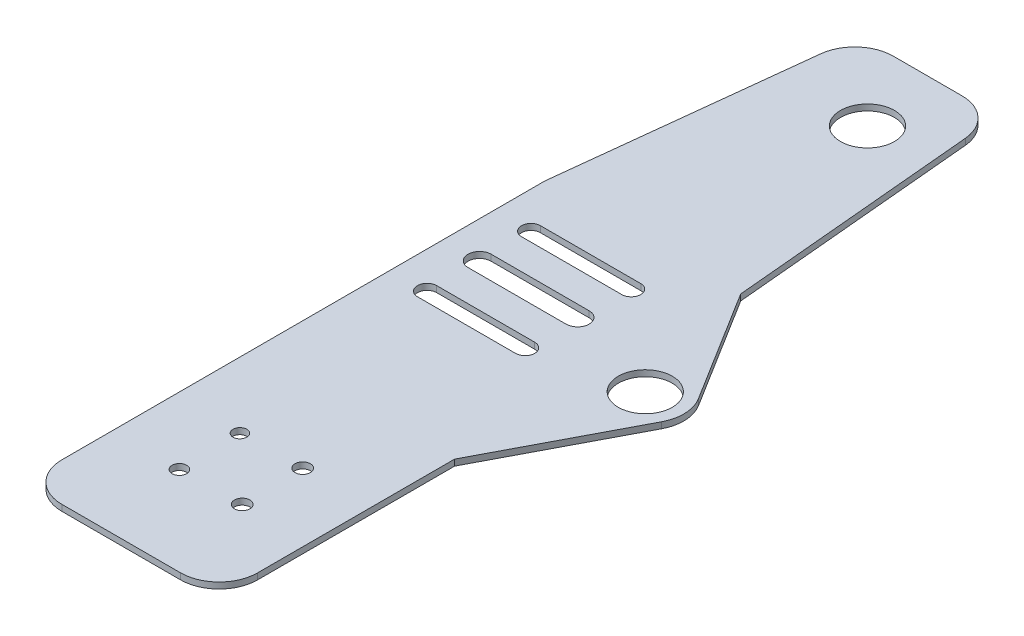
ISO-10303-21;
HEADER;
FILE_DESCRIPTION(('STEP AP214'),'2;1');
FILE_NAME('part.step','',(''),(''),'','','');
FILE_SCHEMA(('AUTOMOTIVE_DESIGN { 1 0 10303 214 1 1 1 1 }'));
ENDSEC;
DATA;
#1=APPLICATION_CONTEXT('core data for automotive mechanical design processes');
#2=APPLICATION_PROTOCOL_DEFINITION('international standard','automotive_design',2000,#1);
#3=PRODUCT_CONTEXT('',#1,'mechanical');
#4=PRODUCT('Part','Part','',(#3));
#5=PRODUCT_RELATED_PRODUCT_CATEGORY('part','',(#4));
#6=PRODUCT_DEFINITION_FORMATION('','',#4);
#7=PRODUCT_DEFINITION_CONTEXT('part definition',#1,'design');
#8=PRODUCT_DEFINITION('design','',#6,#7);
#9=PRODUCT_DEFINITION_SHAPE('','',#8);
#10=(LENGTH_UNIT() NAMED_UNIT(*) SI_UNIT(.MILLI.,.METRE.));
#11=(NAMED_UNIT(*) PLANE_ANGLE_UNIT() SI_UNIT($,.RADIAN.));
#12=(NAMED_UNIT(*) SI_UNIT($,.STERADIAN.) SOLID_ANGLE_UNIT());
#13=UNCERTAINTY_MEASURE_WITH_UNIT(LENGTH_MEASURE(1.E-05),#10,'distance_accuracy_value','');
#14=(GEOMETRIC_REPRESENTATION_CONTEXT(3) GLOBAL_UNCERTAINTY_ASSIGNED_CONTEXT((#13)) GLOBAL_UNIT_ASSIGNED_CONTEXT((#10,
#11,#12)) REPRESENTATION_CONTEXT('',''));
#15=CARTESIAN_POINT('',(0.,0.,0.));
#16=DIRECTION('',(0.,0.,1.));
#17=DIRECTION('',(1.,0.,0.));
#18=AXIS2_PLACEMENT_3D('',#15,#16,#17);
#19=CARTESIAN_POINT('',(50.8,1.5875,0.));
#20=DIRECTION('',(-1.,0.,0.));
#21=DIRECTION('',(0.,0.,1.));
#22=AXIS2_PLACEMENT_3D('',#19,#20,#21);
#23=PLANE('',#22);
#24=DIRECTION('',(0.,1.,0.));
#25=VECTOR('',#24,1.);
#26=CARTESIAN_POINT('',(50.8,0.,-61.1242433169714));
#27=LINE('',#26,#25);
#28=CARTESIAN_POINT('',(50.8,0.,-61.1242433169714));
#29=VERTEX_POINT('',#28);
#30=CARTESIAN_POINT('',(50.8,1.5875,-61.1242433169714));
#31=VERTEX_POINT('',#30);
#32=EDGE_CURVE('E219',#29,#31,#27,.T.);
#33=ORIENTED_EDGE('',*,*,#32,.T.);
#34=DIRECTION('',(0.,0.,-1.));
#35=VECTOR('',#34,1.);
#36=CARTESIAN_POINT('',(50.8,1.5875,0.));
#37=LINE('',#36,#35);
#38=CARTESIAN_POINT('',(50.8,1.5875,-10.));
#39=VERTEX_POINT('',#38);
#40=EDGE_CURVE('E278',#39,#31,#37,.T.);
#41=ORIENTED_EDGE('',*,*,#40,.F.);
#42=DIRECTION('',(0.,-1.,0.));
#43=VECTOR('',#42,1.);
#44=CARTESIAN_POINT('',(50.8,1.5875,-10.));
#45=LINE('',#44,#43);
#46=CARTESIAN_POINT('',(50.8,0.,-10.));
#47=VERTEX_POINT('',#46);
#48=EDGE_CURVE('E231',#39,#47,#45,.T.);
#49=ORIENTED_EDGE('',*,*,#48,.T.);
#50=DIRECTION('',(0.,0.,-1.));
#51=VECTOR('',#50,1.);
#52=CARTESIAN_POINT('',(50.8,0.,0.));
#53=LINE('',#52,#51);
#54=EDGE_CURVE('E211',#47,#29,#53,.T.);
#55=ORIENTED_EDGE('',*,*,#54,.T.);
#56=EDGE_LOOP('',(#33,#41,#49,#55));
#57=FACE_BOUND('',#56,.T.);
#58=ADVANCED_FACE('F36',(#57),#23,.F.);
#59=CARTESIAN_POINT('',(62.5839450667383,1.5875,-5.68716003291169));
#60=DIRECTION('',(0.995896490758646,0.,-0.0904996115716226));
#61=DIRECTION('',(-0.0904996115716226,0.,-0.995896490758646));
#62=AXIS2_PLACEMENT_3D('',#59,#60,#61);
#63=PLANE('',#62);
#64=DIRECTION('',(0.0904996115716226,0.,0.995896490758646));
#65=VECTOR('',#64,1.);
#66=CARTESIAN_POINT('',(62.5839450667383,0.,-5.68716003291169));
#67=LINE('',#66,#65);
#68=CARTESIAN_POINT('',(44.9712322558071,0.,-199.504996115716));
#69=VERTEX_POINT('',#68);
#70=CARTESIAN_POINT('',(50.8,0.,-135.362739137133));
#71=VERTEX_POINT('',#70);
#72=EDGE_CURVE('E245',#69,#71,#67,.T.);
#73=ORIENTED_EDGE('',*,*,#72,.F.);
#74=DIRECTION('',(0.,1.,0.));
#75=VECTOR('',#74,1.);
#76=CARTESIAN_POINT('',(44.9712322558071,1.5875,-199.504996115716));
#77=LINE('',#76,#75);
#78=CARTESIAN_POINT('',(44.9712322558071,1.5875,-199.504996115716));
#79=VERTEX_POINT('',#78);
#80=EDGE_CURVE('E285',#69,#79,#77,.T.);
#81=ORIENTED_EDGE('',*,*,#80,.T.);
#82=DIRECTION('',(0.0904996115716226,0.,0.995896490758646));
#83=VECTOR('',#82,1.);
#84=CARTESIAN_POINT('',(62.5839450667383,1.5875,-5.68716003291169));
#85=LINE('',#84,#83);
#86=CARTESIAN_POINT('',(50.8,1.5875,-135.362739137133));
#87=VERTEX_POINT('',#86);
#88=EDGE_CURVE('E378',#79,#87,#85,.T.);
#89=ORIENTED_EDGE('',*,*,#88,.T.);
#90=DIRECTION('',(0.,-1.,0.));
#91=VECTOR('',#90,1.);
#92=CARTESIAN_POINT('',(50.8,1.5875,-135.362739137133));
#93=LINE('',#92,#91);
#94=EDGE_CURVE('E254',#87,#71,#93,.T.);
#95=ORIENTED_EDGE('',*,*,#94,.T.);
#96=EDGE_LOOP('',(#73,#81,#89,#95));
#97=FACE_BOUND('',#96,.T.);
#98=ADVANCED_FACE('F454',(#97),#63,.T.);
#99=CARTESIAN_POINT('',(-14.98921776084,1.5875,-1.68067913585209));
#100=DIRECTION('',(0.99377255268871,0.,0.111427615619135));
#101=DIRECTION('',(0.111427615619135,0.,-0.99377255268871));
#102=AXIS2_PLACEMENT_3D('',#99,#100,#101);
#103=PLANE('',#102);
#104=DIRECTION('',(-0.111427615619135,0.,0.99377255268871));
#105=VECTOR('',#104,1.);
#106=CARTESIAN_POINT('',(-14.98921776084,1.5875,-1.68067913585209));
#107=LINE('',#106,#105);
#108=CARTESIAN_POINT('',(7.21547230506596,1.5875,-199.714276156191));
#109=VERTEX_POINT('',#108);
#110=CARTESIAN_POINT('',(0.,1.5875,-135.362739137134));
#111=VERTEX_POINT('',#110);
#112=EDGE_CURVE('E383',#109,#111,#107,.T.);
#113=ORIENTED_EDGE('',*,*,#112,.F.);
#114=DIRECTION('',(0.,1.,0.));
#115=VECTOR('',#114,1.);
#116=CARTESIAN_POINT('',(7.21547230506596,0.,-199.714276156191));
#117=LINE('',#116,#115);
#118=CARTESIAN_POINT('',(7.21547230506596,0.,-199.714276156191));
#119=VERTEX_POINT('',#118);
#120=EDGE_CURVE('E11',#109,#119,#117,.F.);
#121=ORIENTED_EDGE('',*,*,#120,.T.);
#122=DIRECTION('',(-0.111427615619135,0.,0.99377255268871));
#123=VECTOR('',#122,1.);
#124=CARTESIAN_POINT('',(-14.98921776084,0.,-1.68067913585209));
#125=LINE('',#124,#123);
#126=CARTESIAN_POINT('',(0.,0.,-135.362739137134));
#127=VERTEX_POINT('',#126);
#128=EDGE_CURVE('E247',#119,#127,#125,.T.);
#129=ORIENTED_EDGE('',*,*,#128,.T.);
#130=DIRECTION('',(0.,-1.,0.));
#131=VECTOR('',#130,1.);
#132=CARTESIAN_POINT('',(0.,1.5875,-135.362739137134));
#133=LINE('',#132,#131);
#134=EDGE_CURVE('E251',#111,#127,#133,.T.);
#135=ORIENTED_EDGE('',*,*,#134,.F.);
#136=EDGE_LOOP('',(#113,#121,#129,#135));
#137=FACE_BOUND('',#136,.T.);
#138=ADVANCED_FACE('F459',(#137),#103,.F.);
#139=CARTESIAN_POINT('',(0.,1.5875,0.));
#140=DIRECTION('',(0.,1.,0.));
#141=DIRECTION('',(0.,0.,1.));
#142=AXIS2_PLACEMENT_3D('',#139,#140,#141);
#143=PLANE('',#142);
#144=CARTESIAN_POINT('',(60.4000000000002,1.5875,-101.000996728214));
#145=DIRECTION('',(0.,1.,0.));
#146=DIRECTION('',(0.,0.,1.));
#147=AXIS2_PLACEMENT_3D('',#144,#145,#146);
#148=CIRCLE('',#147,7.);
#149=CARTESIAN_POINT('',(60.4000000000002,1.5875,-94.0009967282143));
#150=VERTEX_POINT('',#149);
#151=EDGE_CURVE('E505',#150,#150,#148,.T.);
#152=ORIENTED_EDGE('',*,*,#151,.F.);
#153=EDGE_LOOP('',(#152));
#154=FACE_BOUND('',#153,.T.);
#155=DIRECTION('',(-0.52824164194853,0.,-0.849094086489548));
#156=VECTOR('',#155,1.);
#157=CARTESIAN_POINT('',(97.3386305900608,1.5875,-60.5566790136255));
#158=LINE('',#157,#156);
#159=CARTESIAN_POINT('',(68.8909408648957,1.5875,-106.2834131477));
#160=VERTEX_POINT('',#159);
#161=EDGE_CURVE('E216',#160,#87,#158,.T.);
#162=ORIENTED_EDGE('',*,*,#161,.T.);
#163=ORIENTED_EDGE('',*,*,#88,.F.);
#164=CARTESIAN_POINT('',(35.0122673482206,1.5875,-198.6));
#165=DIRECTION('',(0.,1.,0.));
#166=DIRECTION('',(0.,0.,1.));
#167=AXIS2_PLACEMENT_3D('',#164,#165,#166);
#168=CIRCLE('',#167,10.);
#169=CARTESIAN_POINT('',(35.0122673482206,1.5875,-208.6));
#170=VERTEX_POINT('',#169);
#171=EDGE_CURVE('E288',#79,#170,#168,.T.);
#172=ORIENTED_EDGE('',*,*,#171,.T.);
#173=DIRECTION('',(-1.,0.,0.));
#174=VECTOR('',#173,1.);
#175=CARTESIAN_POINT('',(0.,1.5875,-208.6));
#176=LINE('',#175,#174);
#177=CARTESIAN_POINT('',(17.1531978319531,1.5875,-208.6));
#178=VERTEX_POINT('',#177);
#179=EDGE_CURVE('E316',#170,#178,#176,.T.);
#180=ORIENTED_EDGE('',*,*,#179,.T.);
#181=CARTESIAN_POINT('',(17.1531978319531,1.5875,-198.6));
#182=DIRECTION('',(0.,1.,0.));
#183=DIRECTION('',(0.,0.,1.));
#184=AXIS2_PLACEMENT_3D('',#181,#182,#183);
#185=CIRCLE('',#184,10.);
#186=EDGE_CURVE('E59',#178,#109,#185,.T.);
#187=ORIENTED_EDGE('',*,*,#186,.T.);
#188=ORIENTED_EDGE('',*,*,#112,.T.);
#189=DIRECTION('',(0.,0.,-1.));
#190=VECTOR('',#189,1.);
#191=CARTESIAN_POINT('',(0.,1.5875,0.));
#192=LINE('',#191,#190);
#193=CARTESIAN_POINT('',(0.,1.5875,-10.));
#194=VERTEX_POINT('',#193);
#195=EDGE_CURVE('E385',#194,#111,#192,.T.);
#196=ORIENTED_EDGE('',*,*,#195,.F.);
#197=CARTESIAN_POINT('',(10.,1.5875,-10.));
#198=DIRECTION('',(0.,1.,0.));
#199=DIRECTION('',(0.,0.,1.));
#200=AXIS2_PLACEMENT_3D('',#197,#198,#199);
#201=CIRCLE('',#200,10.);
#202=CARTESIAN_POINT('',(10.,1.5875,0.));
#203=VERTEX_POINT('',#202);
#204=EDGE_CURVE('E307',#194,#203,#201,.T.);
#205=ORIENTED_EDGE('',*,*,#204,.T.);
#206=DIRECTION('',(1.,0.,0.));
#207=VECTOR('',#206,1.);
#208=CARTESIAN_POINT('',(0.,1.5875,0.));
#209=LINE('',#208,#207);
#210=CARTESIAN_POINT('',(40.8,1.5875,0.));
#211=VERTEX_POINT('',#210);
#212=EDGE_CURVE('E380',#203,#211,#209,.T.);
#213=ORIENTED_EDGE('',*,*,#212,.T.);
#214=CARTESIAN_POINT('',(40.8,1.5875,-10.));
#215=DIRECTION('',(0.,1.,0.));
#216=DIRECTION('',(0.,0.,1.));
#217=AXIS2_PLACEMENT_3D('',#214,#215,#216);
#218=CIRCLE('',#217,10.);
#219=EDGE_CURVE('E309',#211,#39,#218,.T.);
#220=ORIENTED_EDGE('',*,*,#219,.T.);
#221=ORIENTED_EDGE('',*,*,#40,.T.);
#222=DIRECTION('',(-0.464026819232771,0.,0.885821150702961));
#223=VECTOR('',#222,1.);
#224=CARTESIAN_POINT('',(14.7368982455347,1.5875,7.71974795680346));
#225=LINE('',#224,#223);
#226=CARTESIAN_POINT('',(69.2582115070298,1.5875,-96.3607285358866));
#227=VERTEX_POINT('',#226);
#228=EDGE_CURVE('E222',#227,#31,#225,.T.);
#229=ORIENTED_EDGE('',*,*,#228,.F.);
#230=CARTESIAN_POINT('',(60.4000000000002,1.5875,-101.000996728214));
#231=DIRECTION('',(0.,1.,0.));
#232=DIRECTION('',(0.,0.,1.));
#233=AXIS2_PLACEMENT_3D('',#230,#231,#232);
#234=CIRCLE('',#233,9.99999999999999);
#235=EDGE_CURVE('E494',#227,#160,#234,.T.);
#236=ORIENTED_EDGE('',*,*,#235,.T.);
#237=EDGE_LOOP('',(#162,#163,#172,#180,#187,#188,#196,#205,#213,#220,#221,#229,#236));
#238=FACE_BOUND('',#237,.T.);
#239=CARTESIAN_POINT('',(35.5096753408515,1.5875,-122.250359096769));
#240=DIRECTION('',(0.,1.,0.));
#241=DIRECTION('',(0.,0.,1.));
#242=AXIS2_PLACEMENT_3D('',#239,#240,#241);
#243=CIRCLE('',#242,2.46542385323101);
#244=CARTESIAN_POINT('',(35.5096753408515,1.5875,-119.784935243538));
#245=VERTEX_POINT('',#244);
#246=CARTESIAN_POINT('',(35.5096753408515,1.5875,-124.71578295));
#247=VERTEX_POINT('',#246);
#248=EDGE_CURVE('E232',#245,#247,#243,.T.);
#249=ORIENTED_EDGE('',*,*,#248,.F.);
#250=DIRECTION('',(1.,0.,0.));
#251=VECTOR('',#250,1.);
#252=CARTESIAN_POINT('',(0.,1.5875,-119.784935243538));
#253=LINE('',#252,#251);
#254=CARTESIAN_POINT('',(9.49203327256304,1.5875,-119.784935243538));
#255=VERTEX_POINT('',#254);
#256=EDGE_CURVE('E236',#255,#245,#253,.T.);
#257=ORIENTED_EDGE('',*,*,#256,.F.);
#258=CARTESIAN_POINT('',(9.49203327256303,1.5875,-122.250359096769));
#259=DIRECTION('',(0.,1.,0.));
#260=DIRECTION('',(0.,0.,1.));
#261=AXIS2_PLACEMENT_3D('',#258,#259,#260);
#262=CIRCLE('',#261,2.465423853231);
#263=CARTESIAN_POINT('',(9.49203327256303,1.5875,-124.71578295));
#264=VERTEX_POINT('',#263);
#265=EDGE_CURVE('E336',#264,#255,#262,.T.);
#266=ORIENTED_EDGE('',*,*,#265,.F.);
#267=DIRECTION('',(1.,0.,0.));
#268=VECTOR('',#267,1.);
#269=CARTESIAN_POINT('',(0.,1.5875,-124.71578295));
#270=LINE('',#269,#268);
#271=EDGE_CURVE('E339',#264,#247,#270,.T.);
#272=ORIENTED_EDGE('',*,*,#271,.T.);
#273=EDGE_LOOP('',(#249,#257,#266,#272));
#274=FACE_BOUND('',#273,.T.);
#275=CARTESIAN_POINT('',(9.49203327256301,1.5875,-108.90993524));
#276=DIRECTION('',(0.,1.,0.));
#277=DIRECTION('',(0.,0.,1.));
#278=AXIS2_PLACEMENT_3D('',#275,#276,#277);
#279=CIRCLE('',#278,3.);
#280=CARTESIAN_POINT('',(9.49203327256301,1.5875,-111.90993524));
#281=VERTEX_POINT('',#280);
#282=CARTESIAN_POINT('',(9.49203327256301,1.5875,-105.90993524));
#283=VERTEX_POINT('',#282);
#284=EDGE_CURVE('E341',#281,#283,#279,.T.);
#285=ORIENTED_EDGE('',*,*,#284,.F.);
#286=DIRECTION('',(1.,0.,0.));
#287=VECTOR('',#286,1.);
#288=CARTESIAN_POINT('',(0.,1.5875,-111.90993524));
#289=LINE('',#288,#287);
#290=CARTESIAN_POINT('',(34.9257409027608,1.5875,-111.90993524));
#291=VERTEX_POINT('',#290);
#292=EDGE_CURVE('E344',#281,#291,#289,.T.);
#293=ORIENTED_EDGE('',*,*,#292,.T.);
#294=CARTESIAN_POINT('',(34.9257409027608,1.5875,-108.90993524));
#295=DIRECTION('',(0.,1.,0.));
#296=DIRECTION('',(0.,0.,1.));
#297=AXIS2_PLACEMENT_3D('',#294,#295,#296);
#298=CIRCLE('',#297,3.);
#299=CARTESIAN_POINT('',(34.9257409027608,1.5875,-105.90993524));
#300=VERTEX_POINT('',#299);
#301=EDGE_CURVE('E346',#300,#291,#298,.T.);
#302=ORIENTED_EDGE('',*,*,#301,.F.);
#303=DIRECTION('',(1.,0.,0.));
#304=VECTOR('',#303,1.);
#305=CARTESIAN_POINT('',(0.,1.5875,-105.90993524));
#306=LINE('',#305,#304);
#307=EDGE_CURVE('E349',#283,#300,#306,.T.);
#308=ORIENTED_EDGE('',*,*,#307,.F.);
#309=EDGE_LOOP('',(#285,#293,#302,#308));
#310=FACE_BOUND('',#309,.T.);
#311=CARTESIAN_POINT('',(34.9257409027608,1.5875,-95.28493524));
#312=DIRECTION('',(0.,1.,0.));
#313=DIRECTION('',(0.,0.,1.));
#314=AXIS2_PLACEMENT_3D('',#311,#312,#313);
#315=CIRCLE('',#314,2.5);
#316=CARTESIAN_POINT('',(34.9257409027608,1.5875,-92.78493524));
#317=VERTEX_POINT('',#316);
#318=CARTESIAN_POINT('',(34.9257409027608,1.5875,-97.78493524));
#319=VERTEX_POINT('',#318);
#320=EDGE_CURVE('E352',#317,#319,#315,.T.);
#321=ORIENTED_EDGE('',*,*,#320,.F.);
#322=DIRECTION('',(1.,0.,0.));
#323=VECTOR('',#322,1.);
#324=CARTESIAN_POINT('',(0.,1.5875,-92.78493524));
#325=LINE('',#324,#323);
#326=CARTESIAN_POINT('',(9.49203327256304,1.5875,-92.78493524));
#327=VERTEX_POINT('',#326);
#328=EDGE_CURVE('E355',#327,#317,#325,.T.);
#329=ORIENTED_EDGE('',*,*,#328,.F.);
#330=CARTESIAN_POINT('',(9.49203327256304,1.5875,-95.28493524));
#331=DIRECTION('',(0.,1.,0.));
#332=DIRECTION('',(0.,0.,1.));
#333=AXIS2_PLACEMENT_3D('',#330,#331,#332);
#334=CIRCLE('',#333,2.5);
#335=CARTESIAN_POINT('',(9.49203327256304,1.5875,-97.78493524));
#336=VERTEX_POINT('',#335);
#337=EDGE_CURVE('E358',#336,#327,#334,.T.);
#338=ORIENTED_EDGE('',*,*,#337,.F.);
#339=DIRECTION('',(1.,0.,0.));
#340=VECTOR('',#339,1.);
#341=CARTESIAN_POINT('',(0.,1.5875,-97.78493524));
#342=LINE('',#341,#340);
#343=EDGE_CURVE('E361',#336,#319,#342,.T.);
#344=ORIENTED_EDGE('',*,*,#343,.T.);
#345=EDGE_LOOP('',(#321,#329,#338,#344));
#346=FACE_BOUND('',#345,.T.);
#347=CARTESIAN_POINT('',(17.1273843845573,1.5875,-39.079069546219));
#348=DIRECTION('',(0.,1.,0.));
#349=DIRECTION('',(0.,0.,1.));
#350=AXIS2_PLACEMENT_3D('',#347,#348,#349);
#351=CIRCLE('',#350,1.78603357375501);
#352=CARTESIAN_POINT('',(17.1273843845573,1.5875,-37.293035972464));
#353=VERTEX_POINT('',#352);
#354=EDGE_CURVE('E363',#353,#353,#351,.T.);
#355=ORIENTED_EDGE('',*,*,#354,.F.);
#356=EDGE_LOOP('',(#355));
#357=FACE_BOUND('',#356,.T.);
#358=CARTESIAN_POINT('',(33.1247368376099,1.5875,-39.370127088315));
#359=DIRECTION('',(0.,1.,0.));
#360=DIRECTION('',(0.,0.,1.));
#361=AXIS2_PLACEMENT_3D('',#358,#359,#360);
#362=CIRCLE('',#361,2.00000000001303);
#363=CARTESIAN_POINT('',(33.1247368376099,1.5875,-37.370127088302));
#364=VERTEX_POINT('',#363);
#365=EDGE_CURVE('E366',#364,#364,#362,.T.);
#366=ORIENTED_EDGE('',*,*,#365,.F.);
#367=EDGE_LOOP('',(#366));
#368=FACE_BOUND('',#367,.T.);
#369=CARTESIAN_POINT('',(33.4157943797059,1.5875,-23.3727746352624));
#370=DIRECTION('',(0.,1.,0.));
#371=DIRECTION('',(0.,0.,1.));
#372=AXIS2_PLACEMENT_3D('',#369,#370,#371);
#373=CIRCLE('',#372,2.0000000000001);
#374=CARTESIAN_POINT('',(33.4157943797059,1.5875,-21.3727746352623));
#375=VERTEX_POINT('',#374);
#376=EDGE_CURVE('E369',#375,#375,#373,.T.);
#377=ORIENTED_EDGE('',*,*,#376,.F.);
#378=EDGE_LOOP('',(#377));
#379=FACE_BOUND('',#378,.T.);
#380=CARTESIAN_POINT('',(17.4184419266594,1.5875,-23.0817170930641));
#381=DIRECTION('',(0.,1.,0.));
#382=DIRECTION('',(0.,0.,1.));
#383=AXIS2_PLACEMENT_3D('',#380,#381,#382);
#384=CIRCLE('',#383,1.89697912822348);
#385=CARTESIAN_POINT('',(17.4184419266594,1.5875,-21.1847379648406));
#386=VERTEX_POINT('',#385);
#387=EDGE_CURVE('E372',#386,#386,#384,.T.);
#388=ORIENTED_EDGE('',*,*,#387,.F.);
#389=EDGE_LOOP('',(#388));
#390=FACE_BOUND('',#389,.T.);
#391=CARTESIAN_POINT('',(29.5042134535758,1.5875,-189.557234371763));
#392=DIRECTION('',(0.,1.,0.));
#393=DIRECTION('',(0.,0.,1.));
#394=AXIS2_PLACEMENT_3D('',#391,#392,#393);
#395=CIRCLE('',#394,7.);
#396=CARTESIAN_POINT('',(29.5042134535758,1.5875,-182.557234371763));
#397=VERTEX_POINT('',#396);
#398=EDGE_CURVE('E375',#397,#397,#395,.T.);
#399=ORIENTED_EDGE('',*,*,#398,.F.);
#400=EDGE_LOOP('',(#399));
#401=FACE_BOUND('',#400,.T.);
#402=ADVANCED_FACE('F322',(#154,#238,#274,#310,#346,#357,#368,#379,#390,#401),#143,.T.);
#403=CARTESIAN_POINT('',(0.,0.,0.));
#404=DIRECTION('',(0.,1.,0.));
#405=DIRECTION('',(0.,0.,1.));
#406=AXIS2_PLACEMENT_3D('',#403,#404,#405);
#407=PLANE('',#406);
#408=CARTESIAN_POINT('',(60.4000000000002,0.,-101.000996728214));
#409=DIRECTION('',(0.,1.,0.));
#410=DIRECTION('',(0.,0.,1.));
#411=AXIS2_PLACEMENT_3D('',#408,#409,#410);
#412=CIRCLE('',#411,7.);
#413=CARTESIAN_POINT('',(60.4000000000002,0.,-94.0009967282143));
#414=VERTEX_POINT('',#413);
#415=EDGE_CURVE('E496',#414,#414,#412,.T.);
#416=ORIENTED_EDGE('',*,*,#415,.T.);
#417=EDGE_LOOP('',(#416));
#418=FACE_BOUND('',#417,.T.);
#419=ORIENTED_EDGE('',*,*,#72,.T.);
#420=DIRECTION('',(-0.52824164194853,0.,-0.849094086489548));
#421=VECTOR('',#420,1.);
#422=CARTESIAN_POINT('',(97.3386305900608,0.,-60.5566790136255));
#423=LINE('',#422,#421);
#424=CARTESIAN_POINT('',(68.8909408648957,0.,-106.2834131477));
#425=VERTEX_POINT('',#424);
#426=EDGE_CURVE('E227',#425,#71,#423,.T.);
#427=ORIENTED_EDGE('',*,*,#426,.F.);
#428=CARTESIAN_POINT('',(60.4000000000002,0.,-101.000996728214));
#429=DIRECTION('',(0.,1.,0.));
#430=DIRECTION('',(0.,0.,1.));
#431=AXIS2_PLACEMENT_3D('',#428,#429,#430);
#432=CIRCLE('',#431,9.99999999999999);
#433=CARTESIAN_POINT('',(69.2582115070298,0.,-96.3607285358866));
#434=VERTEX_POINT('',#433);
#435=EDGE_CURVE('E214',#434,#425,#432,.T.);
#436=ORIENTED_EDGE('',*,*,#435,.F.);
#437=DIRECTION('',(-0.464026819232771,0.,0.885821150702961));
#438=VECTOR('',#437,1.);
#439=CARTESIAN_POINT('',(14.7368982455347,0.,7.71974795680346));
#440=LINE('',#439,#438);
#441=EDGE_CURVE('E205',#434,#29,#440,.T.);
#442=ORIENTED_EDGE('',*,*,#441,.T.);
#443=ORIENTED_EDGE('',*,*,#54,.F.);
#444=CARTESIAN_POINT('',(40.8,0.,-10.));
#445=DIRECTION('',(0.,1.,0.));
#446=DIRECTION('',(0.,0.,1.));
#447=AXIS2_PLACEMENT_3D('',#444,#445,#446);
#448=CIRCLE('',#447,10.);
#449=CARTESIAN_POINT('',(40.8,0.,0.));
#450=VERTEX_POINT('',#449);
#451=EDGE_CURVE('E299',#47,#450,#448,.F.);
#452=ORIENTED_EDGE('',*,*,#451,.T.);
#453=DIRECTION('',(1.,0.,0.));
#454=VECTOR('',#453,1.);
#455=CARTESIAN_POINT('',(0.,0.,0.));
#456=LINE('',#455,#454);
#457=CARTESIAN_POINT('',(10.,0.,0.));
#458=VERTEX_POINT('',#457);
#459=EDGE_CURVE('E233',#458,#450,#456,.T.);
#460=ORIENTED_EDGE('',*,*,#459,.F.);
#461=CARTESIAN_POINT('',(10.,0.,-10.));
#462=DIRECTION('',(0.,1.,0.));
#463=DIRECTION('',(0.,0.,1.));
#464=AXIS2_PLACEMENT_3D('',#461,#462,#463);
#465=CIRCLE('',#464,10.);
#466=CARTESIAN_POINT('',(0.,0.,-10.));
#467=VERTEX_POINT('',#466);
#468=EDGE_CURVE('E297',#458,#467,#465,.F.);
#469=ORIENTED_EDGE('',*,*,#468,.T.);
#470=DIRECTION('',(0.,0.,-1.));
#471=VECTOR('',#470,1.);
#472=CARTESIAN_POINT('',(0.,0.,0.));
#473=LINE('',#472,#471);
#474=EDGE_CURVE('E239',#467,#127,#473,.T.);
#475=ORIENTED_EDGE('',*,*,#474,.T.);
#476=ORIENTED_EDGE('',*,*,#128,.F.);
#477=CARTESIAN_POINT('',(17.1531978319531,0.,-198.6));
#478=DIRECTION('',(0.,1.,0.));
#479=DIRECTION('',(0.,0.,1.));
#480=AXIS2_PLACEMENT_3D('',#477,#478,#479);
#481=CIRCLE('',#480,10.);
#482=CARTESIAN_POINT('',(17.1531978319531,0.,-208.6));
#483=VERTEX_POINT('',#482);
#484=EDGE_CURVE('E295',#119,#483,#481,.F.);
#485=ORIENTED_EDGE('',*,*,#484,.T.);
#486=DIRECTION('',(-1.,0.,0.));
#487=VECTOR('',#486,1.);
#488=CARTESIAN_POINT('',(0.,0.,-208.6));
#489=LINE('',#488,#487);
#490=CARTESIAN_POINT('',(35.0122673482206,0.,-208.6));
#491=VERTEX_POINT('',#490);
#492=EDGE_CURVE('E258',#491,#483,#489,.T.);
#493=ORIENTED_EDGE('',*,*,#492,.F.);
#494=CARTESIAN_POINT('',(35.0122673482206,0.,-198.6));
#495=DIRECTION('',(0.,1.,0.));
#496=DIRECTION('',(0.,0.,1.));
#497=AXIS2_PLACEMENT_3D('',#494,#495,#496);
#498=CIRCLE('',#497,10.);
#499=EDGE_CURVE('E292',#491,#69,#498,.F.);
#500=ORIENTED_EDGE('',*,*,#499,.T.);
#501=EDGE_LOOP('',(#419,#427,#436,#442,#443,#452,#460,#469,#475,#476,#485,#493,#500));
#502=FACE_BOUND('',#501,.T.);
#503=CARTESIAN_POINT('',(29.5042134535758,0.,-189.557234371763));
#504=DIRECTION('',(0.,1.,0.));
#505=DIRECTION('',(0.,0.,1.));
#506=AXIS2_PLACEMENT_3D('',#503,#504,#505);
#507=CIRCLE('',#506,7.);
#508=CARTESIAN_POINT('',(29.5042134535758,0.,-182.557234371763));
#509=VERTEX_POINT('',#508);
#510=EDGE_CURVE('E243',#509,#509,#507,.T.);
#511=ORIENTED_EDGE('',*,*,#510,.T.);
#512=EDGE_LOOP('',(#511));
#513=FACE_BOUND('',#512,.T.);
#514=CARTESIAN_POINT('',(17.4184419266594,0.,-23.0817170930641));
#515=DIRECTION('',(0.,1.,0.));
#516=DIRECTION('',(0.,0.,1.));
#517=AXIS2_PLACEMENT_3D('',#514,#515,#516);
#518=CIRCLE('',#517,1.89697912822348);
#519=CARTESIAN_POINT('',(17.4184419266594,0.,-21.1847379648406));
#520=VERTEX_POINT('',#519);
#521=EDGE_CURVE('E429',#520,#520,#518,.T.);
#522=ORIENTED_EDGE('',*,*,#521,.T.);
#523=EDGE_LOOP('',(#522));
#524=FACE_BOUND('',#523,.T.);
#525=CARTESIAN_POINT('',(33.4157943797059,0.,-23.3727746352624));
#526=DIRECTION('',(0.,1.,0.));
#527=DIRECTION('',(0.,0.,1.));
#528=AXIS2_PLACEMENT_3D('',#525,#526,#527);
#529=CIRCLE('',#528,2.0000000000001);
#530=CARTESIAN_POINT('',(33.4157943797059,0.,-21.3727746352623));
#531=VERTEX_POINT('',#530);
#532=EDGE_CURVE('E427',#531,#531,#529,.T.);
#533=ORIENTED_EDGE('',*,*,#532,.T.);
#534=EDGE_LOOP('',(#533));
#535=FACE_BOUND('',#534,.T.);
#536=CARTESIAN_POINT('',(33.1247368376099,0.,-39.370127088315));
#537=DIRECTION('',(0.,1.,0.));
#538=DIRECTION('',(0.,0.,1.));
#539=AXIS2_PLACEMENT_3D('',#536,#537,#538);
#540=CIRCLE('',#539,2.00000000001303);
#541=CARTESIAN_POINT('',(33.1247368376099,0.,-37.370127088302));
#542=VERTEX_POINT('',#541);
#543=EDGE_CURVE('E424',#542,#542,#540,.T.);
#544=ORIENTED_EDGE('',*,*,#543,.T.);
#545=EDGE_LOOP('',(#544));
#546=FACE_BOUND('',#545,.T.);
#547=CARTESIAN_POINT('',(17.1273843845573,0.,-39.079069546219));
#548=DIRECTION('',(0.,1.,0.));
#549=DIRECTION('',(0.,0.,1.));
#550=AXIS2_PLACEMENT_3D('',#547,#548,#549);
#551=CIRCLE('',#550,1.78603357375501);
#552=CARTESIAN_POINT('',(17.1273843845573,0.,-37.293035972464));
#553=VERTEX_POINT('',#552);
#554=EDGE_CURVE('E421',#553,#553,#551,.T.);
#555=ORIENTED_EDGE('',*,*,#554,.T.);
#556=EDGE_LOOP('',(#555));
#557=FACE_BOUND('',#556,.T.);
#558=CARTESIAN_POINT('',(34.9257409027608,0.,-95.28493524));
#559=DIRECTION('',(0.,1.,0.));
#560=DIRECTION('',(0.,0.,1.));
#561=AXIS2_PLACEMENT_3D('',#558,#559,#560);
#562=CIRCLE('',#561,2.5);
#563=CARTESIAN_POINT('',(34.9257409027608,0.,-92.78493524));
#564=VERTEX_POINT('',#563);
#565=CARTESIAN_POINT('',(34.9257409027608,0.,-97.78493524));
#566=VERTEX_POINT('',#565);
#567=EDGE_CURVE('E409',#564,#566,#562,.T.);
#568=ORIENTED_EDGE('',*,*,#567,.T.);
#569=DIRECTION('',(1.,0.,0.));
#570=VECTOR('',#569,1.);
#571=CARTESIAN_POINT('',(0.,0.,-97.78493524));
#572=LINE('',#571,#570);
#573=CARTESIAN_POINT('',(9.49203327256304,0.,-97.78493524));
#574=VERTEX_POINT('',#573);
#575=EDGE_CURVE('E418',#574,#566,#572,.T.);
#576=ORIENTED_EDGE('',*,*,#575,.F.);
#577=CARTESIAN_POINT('',(9.49203327256304,0.,-95.28493524));
#578=DIRECTION('',(0.,1.,0.));
#579=DIRECTION('',(0.,0.,1.));
#580=AXIS2_PLACEMENT_3D('',#577,#578,#579);
#581=CIRCLE('',#580,2.5);
#582=CARTESIAN_POINT('',(9.49203327256304,0.,-92.78493524));
#583=VERTEX_POINT('',#582);
#584=EDGE_CURVE('E415',#574,#583,#581,.T.);
#585=ORIENTED_EDGE('',*,*,#584,.T.);
#586=DIRECTION('',(1.,0.,0.));
#587=VECTOR('',#586,1.);
#588=CARTESIAN_POINT('',(0.,0.,-92.78493524));
#589=LINE('',#588,#587);
#590=EDGE_CURVE('E412',#583,#564,#589,.T.);
#591=ORIENTED_EDGE('',*,*,#590,.T.);
#592=EDGE_LOOP('',(#568,#576,#585,#591));
#593=FACE_BOUND('',#592,.T.);
#594=CARTESIAN_POINT('',(9.49203327256301,0.,-108.90993524));
#595=DIRECTION('',(0.,1.,0.));
#596=DIRECTION('',(0.,0.,1.));
#597=AXIS2_PLACEMENT_3D('',#594,#595,#596);
#598=CIRCLE('',#597,3.);
#599=CARTESIAN_POINT('',(9.49203327256301,0.,-111.90993524));
#600=VERTEX_POINT('',#599);
#601=CARTESIAN_POINT('',(9.49203327256301,0.,-105.90993524));
#602=VERTEX_POINT('',#601);
#603=EDGE_CURVE('E397',#600,#602,#598,.T.);
#604=ORIENTED_EDGE('',*,*,#603,.T.);
#605=DIRECTION('',(1.,0.,0.));
#606=VECTOR('',#605,1.);
#607=CARTESIAN_POINT('',(0.,0.,-105.90993524));
#608=LINE('',#607,#606);
#609=CARTESIAN_POINT('',(34.9257409027608,0.,-105.90993524));
#610=VERTEX_POINT('',#609);
#611=EDGE_CURVE('E406',#602,#610,#608,.T.);
#612=ORIENTED_EDGE('',*,*,#611,.T.);
#613=CARTESIAN_POINT('',(34.9257409027608,0.,-108.90993524));
#614=DIRECTION('',(0.,1.,0.));
#615=DIRECTION('',(0.,0.,1.));
#616=AXIS2_PLACEMENT_3D('',#613,#614,#615);
#617=CIRCLE('',#616,3.);
#618=CARTESIAN_POINT('',(34.9257409027608,0.,-111.90993524));
#619=VERTEX_POINT('',#618);
#620=EDGE_CURVE('E403',#610,#619,#617,.T.);
#621=ORIENTED_EDGE('',*,*,#620,.T.);
#622=DIRECTION('',(1.,0.,0.));
#623=VECTOR('',#622,1.);
#624=CARTESIAN_POINT('',(0.,0.,-111.90993524));
#625=LINE('',#624,#623);
#626=EDGE_CURVE('E400',#600,#619,#625,.T.);
#627=ORIENTED_EDGE('',*,*,#626,.F.);
#628=EDGE_LOOP('',(#604,#612,#621,#627));
#629=FACE_BOUND('',#628,.T.);
#630=CARTESIAN_POINT('',(35.5096753408515,0.,-122.250359096769));
#631=DIRECTION('',(0.,1.,0.));
#632=DIRECTION('',(0.,0.,1.));
#633=AXIS2_PLACEMENT_3D('',#630,#631,#632);
#634=CIRCLE('',#633,2.46542385323101);
#635=CARTESIAN_POINT('',(35.5096753408515,0.,-119.784935243538));
#636=VERTEX_POINT('',#635);
#637=CARTESIAN_POINT('',(35.5096753408515,0.,-124.71578295));
#638=VERTEX_POINT('',#637);
#639=EDGE_CURVE('E325',#636,#638,#634,.T.);
#640=ORIENTED_EDGE('',*,*,#639,.T.);
#641=DIRECTION('',(1.,0.,0.));
#642=VECTOR('',#641,1.);
#643=CARTESIAN_POINT('',(0.,0.,-124.71578295));
#644=LINE('',#643,#642);
#645=CARTESIAN_POINT('',(9.49203327256303,0.,-124.71578295));
#646=VERTEX_POINT('',#645);
#647=EDGE_CURVE('E394',#646,#638,#644,.T.);
#648=ORIENTED_EDGE('',*,*,#647,.F.);
#649=CARTESIAN_POINT('',(9.49203327256303,0.,-122.250359096769));
#650=DIRECTION('',(0.,1.,0.));
#651=DIRECTION('',(0.,0.,1.));
#652=AXIS2_PLACEMENT_3D('',#649,#650,#651);
#653=CIRCLE('',#652,2.465423853231);
#654=CARTESIAN_POINT('',(9.49203327256304,0.,-119.784935243538));
#655=VERTEX_POINT('',#654);
#656=EDGE_CURVE('E391',#646,#655,#653,.T.);
#657=ORIENTED_EDGE('',*,*,#656,.T.);
#658=DIRECTION('',(1.,0.,0.));
#659=VECTOR('',#658,1.);
#660=CARTESIAN_POINT('',(0.,0.,-119.784935243538));
#661=LINE('',#660,#659);
#662=EDGE_CURVE('E329',#655,#636,#661,.T.);
#663=ORIENTED_EDGE('',*,*,#662,.T.);
#664=EDGE_LOOP('',(#640,#648,#657,#663));
#665=FACE_BOUND('',#664,.T.);
#666=ADVANCED_FACE('F208',(#418,#502,#513,#524,#535,#546,#557,#593,#629,#665),#407,.F.);
#667=CARTESIAN_POINT('',(0.,1.5875,0.));
#668=DIRECTION('',(-1.,0.,0.));
#669=DIRECTION('',(0.,0.,1.));
#670=AXIS2_PLACEMENT_3D('',#667,#668,#669);
#671=PLANE('',#670);
#672=ORIENTED_EDGE('',*,*,#474,.F.);
#673=DIRECTION('',(0.,-1.,0.));
#674=VECTOR('',#673,1.);
#675=CARTESIAN_POINT('',(0.,1.5875,-10.));
#676=LINE('',#675,#674);
#677=EDGE_CURVE('E51',#467,#194,#676,.F.);
#678=ORIENTED_EDGE('',*,*,#677,.T.);
#679=ORIENTED_EDGE('',*,*,#195,.T.);
#680=ORIENTED_EDGE('',*,*,#134,.T.);
#681=EDGE_LOOP('',(#672,#678,#679,#680));
#682=FACE_BOUND('',#681,.T.);
#683=ADVANCED_FACE('F468',(#682),#671,.T.);
#684=CARTESIAN_POINT('',(0.,1.5875,0.));
#685=DIRECTION('',(0.,0.,-1.));
#686=DIRECTION('',(-1.,0.,0.));
#687=AXIS2_PLACEMENT_3D('',#684,#685,#686);
#688=PLANE('',#687);
#689=ORIENTED_EDGE('',*,*,#459,.T.);
#690=DIRECTION('',(0.,-1.,0.));
#691=VECTOR('',#690,1.);
#692=CARTESIAN_POINT('',(40.8,1.5875,0.));
#693=LINE('',#692,#691);
#694=EDGE_CURVE('E304',#450,#211,#693,.F.);
#695=ORIENTED_EDGE('',*,*,#694,.T.);
#696=ORIENTED_EDGE('',*,*,#212,.F.);
#697=DIRECTION('',(0.,-1.,0.));
#698=VECTOR('',#697,1.);
#699=CARTESIAN_POINT('',(10.,0.,0.));
#700=LINE('',#699,#698);
#701=EDGE_CURVE('E301',#203,#458,#700,.T.);
#702=ORIENTED_EDGE('',*,*,#701,.T.);
#703=EDGE_LOOP('',(#689,#695,#696,#702));
#704=FACE_BOUND('',#703,.T.);
#705=ADVANCED_FACE('F464',(#704),#688,.F.);
#706=CARTESIAN_POINT('',(34.9257409027608,1.5875,-95.28493524));
#707=DIRECTION('',(0.,-1.,0.));
#708=DIRECTION('',(0.,0.,-1.));
#709=AXIS2_PLACEMENT_3D('',#706,#707,#708);
#710=CYLINDRICAL_SURFACE('',#709,2.5);
#711=ORIENTED_EDGE('',*,*,#567,.F.);
#712=DIRECTION('',(0.,-1.,0.));
#713=VECTOR('',#712,1.);
#714=CARTESIAN_POINT('',(34.9257409027608,1.5875,-92.78493524));
#715=LINE('',#714,#713);
#716=EDGE_CURVE('E255',#317,#564,#715,.T.);
#717=ORIENTED_EDGE('',*,*,#716,.F.);
#718=ORIENTED_EDGE('',*,*,#320,.T.);
#719=DIRECTION('',(0.,-1.,0.));
#720=VECTOR('',#719,1.);
#721=CARTESIAN_POINT('',(34.9257409027608,1.5875,-97.78493524));
#722=LINE('',#721,#720);
#723=EDGE_CURVE('E259',#319,#566,#722,.T.);
#724=ORIENTED_EDGE('',*,*,#723,.T.);
#725=EDGE_LOOP('',(#711,#717,#718,#724));
#726=FACE_BOUND('',#725,.T.);
#727=ADVANCED_FACE('F467',(#726),#710,.F.);
#728=CARTESIAN_POINT('',(0.,1.5875,-92.78493524));
#729=DIRECTION('',(0.,0.,-1.));
#730=DIRECTION('',(-1.,0.,0.));
#731=AXIS2_PLACEMENT_3D('',#728,#729,#730);
#732=PLANE('',#731);
#733=ORIENTED_EDGE('',*,*,#590,.F.);
#734=DIRECTION('',(0.,-1.,0.));
#735=VECTOR('',#734,1.);
#736=CARTESIAN_POINT('',(9.49203327256304,1.5875,-92.78493524));
#737=LINE('',#736,#735);
#738=EDGE_CURVE('E264',#327,#583,#737,.T.);
#739=ORIENTED_EDGE('',*,*,#738,.F.);
#740=ORIENTED_EDGE('',*,*,#328,.T.);
#741=ORIENTED_EDGE('',*,*,#716,.T.);
#742=EDGE_LOOP('',(#733,#739,#740,#741));
#743=FACE_BOUND('',#742,.T.);
#744=ADVANCED_FACE('F795',(#743),#732,.T.);
#745=CARTESIAN_POINT('',(9.49203327256304,1.5875,-95.28493524));
#746=DIRECTION('',(0.,-1.,0.));
#747=DIRECTION('',(0.,0.,-1.));
#748=AXIS2_PLACEMENT_3D('',#745,#746,#747);
#749=CYLINDRICAL_SURFACE('',#748,2.5);
#750=ORIENTED_EDGE('',*,*,#584,.F.);
#751=DIRECTION('',(0.,-1.,0.));
#752=VECTOR('',#751,1.);
#753=CARTESIAN_POINT('',(9.49203327256304,1.5875,-97.78493524));
#754=LINE('',#753,#752);
#755=EDGE_CURVE('E261',#336,#574,#754,.T.);
#756=ORIENTED_EDGE('',*,*,#755,.F.);
#757=ORIENTED_EDGE('',*,*,#337,.T.);
#758=ORIENTED_EDGE('',*,*,#738,.T.);
#759=EDGE_LOOP('',(#750,#756,#757,#758));
#760=FACE_BOUND('',#759,.T.);
#761=ADVANCED_FACE('F786',(#760),#749,.F.);
#762=CARTESIAN_POINT('',(9.49203327256301,1.5875,-108.90993524));
#763=DIRECTION('',(0.,-1.,0.));
#764=DIRECTION('',(0.,0.,-1.));
#765=AXIS2_PLACEMENT_3D('',#762,#763,#764);
#766=CYLINDRICAL_SURFACE('',#765,3.);
#767=ORIENTED_EDGE('',*,*,#603,.F.);
#768=DIRECTION('',(0.,-1.,0.));
#769=VECTOR('',#768,1.);
#770=CARTESIAN_POINT('',(9.49203327256301,1.5875,-111.90993524));
#771=LINE('',#770,#769);
#772=EDGE_CURVE('E262',#281,#600,#771,.T.);
#773=ORIENTED_EDGE('',*,*,#772,.F.);
#774=ORIENTED_EDGE('',*,*,#284,.T.);
#775=DIRECTION('',(0.,-1.,0.));
#776=VECTOR('',#775,1.);
#777=CARTESIAN_POINT('',(9.49203327256301,1.5875,-105.90993524));
#778=LINE('',#777,#776);
#779=EDGE_CURVE('E267',#283,#602,#778,.T.);
#780=ORIENTED_EDGE('',*,*,#779,.T.);
#781=EDGE_LOOP('',(#767,#773,#774,#780));
#782=FACE_BOUND('',#781,.T.);
#783=ADVANCED_FACE('F547',(#782),#766,.F.);
#784=CARTESIAN_POINT('',(0.,1.5875,-111.90993524));
#785=DIRECTION('',(0.,0.,-1.));
#786=DIRECTION('',(-1.,0.,0.));
#787=AXIS2_PLACEMENT_3D('',#784,#785,#786);
#788=PLANE('',#787);
#789=ORIENTED_EDGE('',*,*,#626,.T.);
#790=DIRECTION('',(0.,-1.,0.));
#791=VECTOR('',#790,1.);
#792=CARTESIAN_POINT('',(34.9257409027608,1.5875,-111.90993524));
#793=LINE('',#792,#791);
#794=EDGE_CURVE('E272',#291,#619,#793,.T.);
#795=ORIENTED_EDGE('',*,*,#794,.F.);
#796=ORIENTED_EDGE('',*,*,#292,.F.);
#797=ORIENTED_EDGE('',*,*,#772,.T.);
#798=EDGE_LOOP('',(#789,#795,#796,#797));
#799=FACE_BOUND('',#798,.T.);
#800=ADVANCED_FACE('F768',(#799),#788,.F.);
#801=CARTESIAN_POINT('',(34.9257409027608,1.5875,-108.90993524));
#802=DIRECTION('',(0.,-1.,0.));
#803=DIRECTION('',(0.,0.,-1.));
#804=AXIS2_PLACEMENT_3D('',#801,#802,#803);
#805=CYLINDRICAL_SURFACE('',#804,3.);
#806=ORIENTED_EDGE('',*,*,#620,.F.);
#807=DIRECTION('',(0.,-1.,0.));
#808=VECTOR('',#807,1.);
#809=CARTESIAN_POINT('',(34.9257409027608,1.5875,-105.90993524));
#810=LINE('',#809,#808);
#811=EDGE_CURVE('E269',#300,#610,#810,.T.);
#812=ORIENTED_EDGE('',*,*,#811,.F.);
#813=ORIENTED_EDGE('',*,*,#301,.T.);
#814=ORIENTED_EDGE('',*,*,#794,.T.);
#815=EDGE_LOOP('',(#806,#812,#813,#814));
#816=FACE_BOUND('',#815,.T.);
#817=ADVANCED_FACE('F555',(#816),#805,.F.);
#818=CARTESIAN_POINT('',(35.5096753408515,1.5875,-122.250359096769));
#819=DIRECTION('',(0.,-1.,0.));
#820=DIRECTION('',(0.,0.,-1.));
#821=AXIS2_PLACEMENT_3D('',#818,#819,#820);
#822=CYLINDRICAL_SURFACE('',#821,2.46542385323101);
#823=ORIENTED_EDGE('',*,*,#639,.F.);
#824=DIRECTION('',(0.,-1.,0.));
#825=VECTOR('',#824,1.);
#826=CARTESIAN_POINT('',(35.5096753408515,1.5875,-119.784935243538));
#827=LINE('',#826,#825);
#828=EDGE_CURVE('E270',#245,#636,#827,.T.);
#829=ORIENTED_EDGE('',*,*,#828,.F.);
#830=ORIENTED_EDGE('',*,*,#248,.T.);
#831=DIRECTION('',(0.,-1.,0.));
#832=VECTOR('',#831,1.);
#833=CARTESIAN_POINT('',(35.5096753408515,1.5875,-124.71578295));
#834=LINE('',#833,#832);
#835=EDGE_CURVE('E275',#247,#638,#834,.T.);
#836=ORIENTED_EDGE('',*,*,#835,.T.);
#837=EDGE_LOOP('',(#823,#829,#830,#836));
#838=FACE_BOUND('',#837,.T.);
#839=ADVANCED_FACE('F552',(#838),#822,.F.);
#840=CARTESIAN_POINT('',(0.,1.5875,-119.784935243538));
#841=DIRECTION('',(0.,0.,-1.));
#842=DIRECTION('',(-1.,0.,0.));
#843=AXIS2_PLACEMENT_3D('',#840,#841,#842);
#844=PLANE('',#843);
#845=ORIENTED_EDGE('',*,*,#662,.F.);
#846=DIRECTION('',(0.,-1.,0.));
#847=VECTOR('',#846,1.);
#848=CARTESIAN_POINT('',(9.49203327256304,1.5875,-119.784935243538));
#849=LINE('',#848,#847);
#850=EDGE_CURVE('E280',#255,#655,#849,.T.);
#851=ORIENTED_EDGE('',*,*,#850,.F.);
#852=ORIENTED_EDGE('',*,*,#256,.T.);
#853=ORIENTED_EDGE('',*,*,#828,.T.);
#854=EDGE_LOOP('',(#845,#851,#852,#853));
#855=FACE_BOUND('',#854,.T.);
#856=ADVANCED_FACE('F449',(#855),#844,.T.);
#857=CARTESIAN_POINT('',(9.49203327256303,1.5875,-122.250359096769));
#858=DIRECTION('',(0.,-1.,0.));
#859=DIRECTION('',(0.,0.,-1.));
#860=AXIS2_PLACEMENT_3D('',#857,#858,#859);
#861=CYLINDRICAL_SURFACE('',#860,2.465423853231);
#862=ORIENTED_EDGE('',*,*,#656,.F.);
#863=DIRECTION('',(0.,-1.,0.));
#864=VECTOR('',#863,1.);
#865=CARTESIAN_POINT('',(9.49203327256303,1.5875,-124.71578295));
#866=LINE('',#865,#864);
#867=EDGE_CURVE('E277',#264,#646,#866,.T.);
#868=ORIENTED_EDGE('',*,*,#867,.F.);
#869=ORIENTED_EDGE('',*,*,#265,.T.);
#870=ORIENTED_EDGE('',*,*,#850,.T.);
#871=EDGE_LOOP('',(#862,#868,#869,#870));
#872=FACE_BOUND('',#871,.T.);
#873=ADVANCED_FACE('F439',(#872),#861,.F.);
#874=CARTESIAN_POINT('',(29.5042134535758,1.5875,-189.557234371763));
#875=DIRECTION('',(0.,-1.,0.));
#876=DIRECTION('',(0.,0.,-1.));
#877=AXIS2_PLACEMENT_3D('',#874,#875,#876);
#878=CYLINDRICAL_SURFACE('',#877,7.);
#879=ORIENTED_EDGE('',*,*,#398,.T.);
#880=EDGE_LOOP('',(#879));
#881=FACE_BOUND('',#880,.T.);
#882=ORIENTED_EDGE('',*,*,#510,.F.);
#883=EDGE_LOOP('',(#882));
#884=FACE_BOUND('',#883,.T.);
#885=ADVANCED_FACE('F436',(#881,#884),#878,.F.);
#886=CARTESIAN_POINT('',(17.4184419266594,1.5875,-23.0817170930641));
#887=DIRECTION('',(0.,-1.,0.));
#888=DIRECTION('',(0.,0.,-1.));
#889=AXIS2_PLACEMENT_3D('',#886,#887,#888);
#890=CYLINDRICAL_SURFACE('',#889,1.89697912822348);
#891=ORIENTED_EDGE('',*,*,#387,.T.);
#892=EDGE_LOOP('',(#891));
#893=FACE_BOUND('',#892,.T.);
#894=ORIENTED_EDGE('',*,*,#521,.F.);
#895=EDGE_LOOP('',(#894));
#896=FACE_BOUND('',#895,.T.);
#897=ADVANCED_FACE('F438',(#893,#896),#890,.F.);
#898=CARTESIAN_POINT('',(33.4157943797059,1.5875,-23.3727746352624));
#899=DIRECTION('',(0.,-1.,0.));
#900=DIRECTION('',(0.,0.,-1.));
#901=AXIS2_PLACEMENT_3D('',#898,#899,#900);
#902=CYLINDRICAL_SURFACE('',#901,2.0000000000001);
#903=ORIENTED_EDGE('',*,*,#376,.T.);
#904=EDGE_LOOP('',(#903));
#905=FACE_BOUND('',#904,.T.);
#906=ORIENTED_EDGE('',*,*,#532,.F.);
#907=EDGE_LOOP('',(#906));
#908=FACE_BOUND('',#907,.T.);
#909=ADVANCED_FACE('F446',(#905,#908),#902,.F.);
#910=CARTESIAN_POINT('',(33.1247368376099,1.5875,-39.370127088315));
#911=DIRECTION('',(0.,-1.,0.));
#912=DIRECTION('',(0.,0.,-1.));
#913=AXIS2_PLACEMENT_3D('',#910,#911,#912);
#914=CYLINDRICAL_SURFACE('',#913,2.00000000001303);
#915=ORIENTED_EDGE('',*,*,#365,.T.);
#916=EDGE_LOOP('',(#915));
#917=FACE_BOUND('',#916,.T.);
#918=ORIENTED_EDGE('',*,*,#543,.F.);
#919=EDGE_LOOP('',(#918));
#920=FACE_BOUND('',#919,.T.);
#921=ADVANCED_FACE('F712',(#917,#920),#914,.F.);
#922=CARTESIAN_POINT('',(17.1273843845573,1.5875,-39.079069546219));
#923=DIRECTION('',(0.,-1.,0.));
#924=DIRECTION('',(0.,0.,-1.));
#925=AXIS2_PLACEMENT_3D('',#922,#923,#924);
#926=CYLINDRICAL_SURFACE('',#925,1.78603357375501);
#927=ORIENTED_EDGE('',*,*,#354,.T.);
#928=EDGE_LOOP('',(#927));
#929=FACE_BOUND('',#928,.T.);
#930=ORIENTED_EDGE('',*,*,#554,.F.);
#931=EDGE_LOOP('',(#930));
#932=FACE_BOUND('',#931,.T.);
#933=ADVANCED_FACE('F702',(#929,#932),#926,.F.);
#934=CARTESIAN_POINT('',(0.,1.5875,-97.78493524));
#935=DIRECTION('',(0.,0.,-1.));
#936=DIRECTION('',(-1.,0.,0.));
#937=AXIS2_PLACEMENT_3D('',#934,#935,#936);
#938=PLANE('',#937);
#939=ORIENTED_EDGE('',*,*,#575,.T.);
#940=ORIENTED_EDGE('',*,*,#723,.F.);
#941=ORIENTED_EDGE('',*,*,#343,.F.);
#942=ORIENTED_EDGE('',*,*,#755,.T.);
#943=EDGE_LOOP('',(#939,#940,#941,#942));
#944=FACE_BOUND('',#943,.T.);
#945=ADVANCED_FACE('F543',(#944),#938,.F.);
#946=CARTESIAN_POINT('',(0.,1.5875,-105.90993524));
#947=DIRECTION('',(0.,0.,-1.));
#948=DIRECTION('',(-1.,0.,0.));
#949=AXIS2_PLACEMENT_3D('',#946,#947,#948);
#950=PLANE('',#949);
#951=ORIENTED_EDGE('',*,*,#611,.F.);
#952=ORIENTED_EDGE('',*,*,#779,.F.);
#953=ORIENTED_EDGE('',*,*,#307,.T.);
#954=ORIENTED_EDGE('',*,*,#811,.T.);
#955=EDGE_LOOP('',(#951,#952,#953,#954));
#956=FACE_BOUND('',#955,.T.);
#957=ADVANCED_FACE('F537',(#956),#950,.T.);
#958=CARTESIAN_POINT('',(0.,1.5875,-124.71578295));
#959=DIRECTION('',(0.,0.,-1.));
#960=DIRECTION('',(-1.,0.,0.));
#961=AXIS2_PLACEMENT_3D('',#958,#959,#960);
#962=PLANE('',#961);
#963=ORIENTED_EDGE('',*,*,#647,.T.);
#964=ORIENTED_EDGE('',*,*,#835,.F.);
#965=ORIENTED_EDGE('',*,*,#271,.F.);
#966=ORIENTED_EDGE('',*,*,#867,.T.);
#967=EDGE_LOOP('',(#963,#964,#965,#966));
#968=FACE_BOUND('',#967,.T.);
#969=ADVANCED_FACE('F530',(#968),#962,.F.);
#970=CARTESIAN_POINT('',(0.,0.,-208.6));
#971=DIRECTION('',(0.,0.,-1.));
#972=DIRECTION('',(-1.,0.,0.));
#973=AXIS2_PLACEMENT_3D('',#970,#971,#972);
#974=PLANE('',#973);
#975=ORIENTED_EDGE('',*,*,#492,.T.);
#976=DIRECTION('',(0.,1.,0.));
#977=VECTOR('',#976,1.);
#978=CARTESIAN_POINT('',(17.1531978319531,1.5875,-208.6));
#979=LINE('',#978,#977);
#980=EDGE_CURVE('E44',#483,#178,#979,.T.);
#981=ORIENTED_EDGE('',*,*,#980,.T.);
#982=ORIENTED_EDGE('',*,*,#179,.F.);
#983=DIRECTION('',(0.,1.,0.));
#984=VECTOR('',#983,1.);
#985=CARTESIAN_POINT('',(35.0122673482206,0.,-208.6));
#986=LINE('',#985,#984);
#987=EDGE_CURVE('E290',#170,#491,#986,.F.);
#988=ORIENTED_EDGE('',*,*,#987,.T.);
#989=EDGE_LOOP('',(#975,#981,#982,#988));
#990=FACE_BOUND('',#989,.T.);
#991=ADVANCED_FACE('F315',(#990),#974,.T.);
#992=CARTESIAN_POINT('',(35.0122673482206,1.5875,-198.6));
#993=DIRECTION('',(0.,1.,0.));
#994=DIRECTION('',(0.,0.,1.));
#995=AXIS2_PLACEMENT_3D('',#992,#993,#994);
#996=CYLINDRICAL_SURFACE('',#995,10.);
#997=ORIENTED_EDGE('',*,*,#499,.F.);
#998=ORIENTED_EDGE('',*,*,#987,.F.);
#999=ORIENTED_EDGE('',*,*,#171,.F.);
#1000=ORIENTED_EDGE('',*,*,#80,.F.);
#1001=EDGE_LOOP('',(#997,#998,#999,#1000));
#1002=FACE_BOUND('',#1001,.T.);
#1003=ADVANCED_FACE('F529',(#1002),#996,.T.);
#1004=CARTESIAN_POINT('',(40.8,1.5875,-10.));
#1005=DIRECTION('',(0.,-1.,0.));
#1006=DIRECTION('',(0.,0.,-1.));
#1007=AXIS2_PLACEMENT_3D('',#1004,#1005,#1006);
#1008=CYLINDRICAL_SURFACE('',#1007,10.);
#1009=ORIENTED_EDGE('',*,*,#219,.F.);
#1010=ORIENTED_EDGE('',*,*,#694,.F.);
#1011=ORIENTED_EDGE('',*,*,#451,.F.);
#1012=ORIENTED_EDGE('',*,*,#48,.F.);
#1013=EDGE_LOOP('',(#1009,#1010,#1011,#1012));
#1014=FACE_BOUND('',#1013,.T.);
#1015=ADVANCED_FACE('F491',(#1014),#1008,.T.);
#1016=CARTESIAN_POINT('',(10.,1.5875,-10.));
#1017=DIRECTION('',(0.,1.,0.));
#1018=DIRECTION('',(0.,0.,1.));
#1019=AXIS2_PLACEMENT_3D('',#1016,#1017,#1018);
#1020=CYLINDRICAL_SURFACE('',#1019,10.);
#1021=ORIENTED_EDGE('',*,*,#204,.F.);
#1022=ORIENTED_EDGE('',*,*,#677,.F.);
#1023=ORIENTED_EDGE('',*,*,#468,.F.);
#1024=ORIENTED_EDGE('',*,*,#701,.F.);
#1025=EDGE_LOOP('',(#1021,#1022,#1023,#1024));
#1026=FACE_BOUND('',#1025,.T.);
#1027=ADVANCED_FACE('F487',(#1026),#1020,.T.);
#1028=CARTESIAN_POINT('',(17.1531978319531,0.,-198.6));
#1029=DIRECTION('',(0.,-1.,0.));
#1030=DIRECTION('',(0.,0.,-1.));
#1031=AXIS2_PLACEMENT_3D('',#1028,#1029,#1030);
#1032=CYLINDRICAL_SURFACE('',#1031,10.);
#1033=ORIENTED_EDGE('',*,*,#484,.F.);
#1034=ORIENTED_EDGE('',*,*,#120,.F.);
#1035=ORIENTED_EDGE('',*,*,#186,.F.);
#1036=ORIENTED_EDGE('',*,*,#980,.F.);
#1037=EDGE_LOOP('',(#1033,#1034,#1035,#1036));
#1038=FACE_BOUND('',#1037,.T.);
#1039=ADVANCED_FACE('F38',(#1038),#1032,.T.);
#1040=CARTESIAN_POINT('',(97.3386305900608,0.,-60.5566790136255));
#1041=DIRECTION('',(0.849094086489548,0.,-0.52824164194853));
#1042=DIRECTION('',(-0.52824164194853,0.,-0.849094086489549));
#1043=AXIS2_PLACEMENT_3D('',#1040,#1041,#1042);
#1044=PLANE('',#1043);
#1045=ORIENTED_EDGE('',*,*,#161,.F.);
#1046=DIRECTION('',(0.,1.,0.));
#1047=VECTOR('',#1046,1.);
#1048=CARTESIAN_POINT('',(68.8909408648957,0.,-106.2834131477));
#1049=LINE('',#1048,#1047);
#1050=EDGE_CURVE('E326',#425,#160,#1049,.T.);
#1051=ORIENTED_EDGE('',*,*,#1050,.F.);
#1052=ORIENTED_EDGE('',*,*,#426,.T.);
#1053=ORIENTED_EDGE('',*,*,#94,.F.);
#1054=EDGE_LOOP('',(#1045,#1051,#1052,#1053));
#1055=FACE_BOUND('',#1054,.T.);
#1056=ADVANCED_FACE('F522',(#1055),#1044,.T.);
#1057=CARTESIAN_POINT('',(60.4000000000002,0.,-101.000996728214));
#1058=DIRECTION('',(0.,1.,0.));
#1059=DIRECTION('',(0.,0.,1.));
#1060=AXIS2_PLACEMENT_3D('',#1057,#1058,#1059);
#1061=CYLINDRICAL_SURFACE('',#1060,9.99999999999999);
#1062=ORIENTED_EDGE('',*,*,#235,.F.);
#1063=DIRECTION('',(0.,1.,0.));
#1064=VECTOR('',#1063,1.);
#1065=CARTESIAN_POINT('',(69.2582115070298,0.,-96.3607285358866));
#1066=LINE('',#1065,#1064);
#1067=EDGE_CURVE('E226',#434,#227,#1066,.T.);
#1068=ORIENTED_EDGE('',*,*,#1067,.F.);
#1069=ORIENTED_EDGE('',*,*,#435,.T.);
#1070=ORIENTED_EDGE('',*,*,#1050,.T.);
#1071=EDGE_LOOP('',(#1062,#1068,#1069,#1070));
#1072=FACE_BOUND('',#1071,.T.);
#1073=ADVANCED_FACE('F499',(#1072),#1061,.T.);
#1074=CARTESIAN_POINT('',(14.7368982455347,0.,7.71974795680346));
#1075=DIRECTION('',(-0.88582115070296,0.,-0.464026819232771));
#1076=DIRECTION('',(-0.464026819232771,0.,0.885821150702961));
#1077=AXIS2_PLACEMENT_3D('',#1074,#1075,#1076);
#1078=PLANE('',#1077);
#1079=ORIENTED_EDGE('',*,*,#228,.T.);
#1080=ORIENTED_EDGE('',*,*,#32,.F.);
#1081=ORIENTED_EDGE('',*,*,#441,.F.);
#1082=ORIENTED_EDGE('',*,*,#1067,.T.);
#1083=EDGE_LOOP('',(#1079,#1080,#1081,#1082));
#1084=FACE_BOUND('',#1083,.T.);
#1085=ADVANCED_FACE('F220',(#1084),#1078,.F.);
#1086=CARTESIAN_POINT('',(60.4000000000002,0.,-101.000996728214));
#1087=DIRECTION('',(0.,1.,0.));
#1088=DIRECTION('',(0.,0.,1.));
#1089=AXIS2_PLACEMENT_3D('',#1086,#1087,#1088);
#1090=CYLINDRICAL_SURFACE('',#1089,7.);
#1091=ORIENTED_EDGE('',*,*,#415,.F.);
#1092=EDGE_LOOP('',(#1091));
#1093=FACE_BOUND('',#1092,.T.);
#1094=ORIENTED_EDGE('',*,*,#151,.T.);
#1095=EDGE_LOOP('',(#1094));
#1096=FACE_BOUND('',#1095,.T.);
#1097=ADVANCED_FACE('F512',(#1093,#1096),#1090,.F.);
#1098=CLOSED_SHELL('',(#58,#98,#138,#402,#666,#683,#705,#727,#744,#761,#783,#800,#817,#839,#856,
#873,#885,#897,#909,#921,#933,#945,#957,#969,#991,#1003,#1015,#1027,#1039,#1056,#1073,#1085,#1097));
#1099=MANIFOLD_SOLID_BREP('B2',#1098);
#1100=ADVANCED_BREP_SHAPE_REPRESENTATION('',(#18,#1099),#14);
#1101=SHAPE_DEFINITION_REPRESENTATION(#9,#1100);
ENDSEC;
END-ISO-10303-21;
